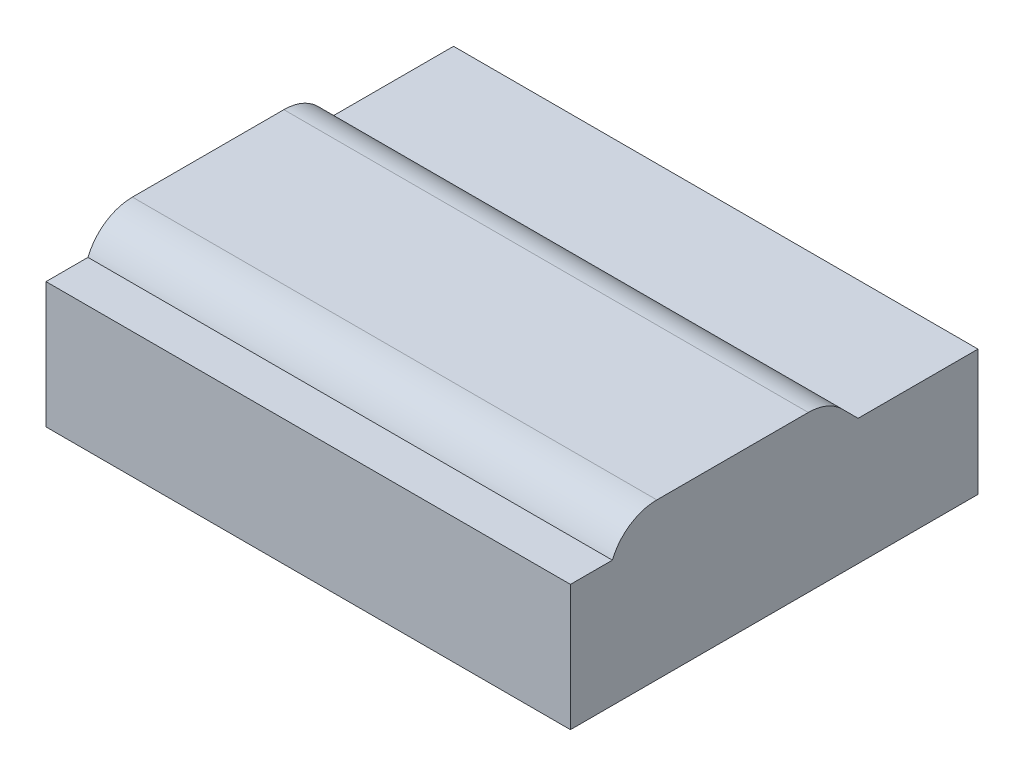
ISO-10303-21;
HEADER;
FILE_DESCRIPTION(('STEP AP214'),'2;1');
FILE_NAME('part.step','',(''),(''),'','','');
FILE_SCHEMA(('AUTOMOTIVE_DESIGN { 1 0 10303 214 1 1 1 1 }'));
ENDSEC;
DATA;
#1=APPLICATION_CONTEXT('core data for automotive mechanical design processes');
#2=APPLICATION_PROTOCOL_DEFINITION('international standard','automotive_design',2000,#1);
#3=PRODUCT_CONTEXT('',#1,'mechanical');
#4=PRODUCT('Part','Part','',(#3));
#5=PRODUCT_RELATED_PRODUCT_CATEGORY('part','',(#4));
#6=PRODUCT_DEFINITION_FORMATION('','',#4);
#7=PRODUCT_DEFINITION_CONTEXT('part definition',#1,'design');
#8=PRODUCT_DEFINITION('design','',#6,#7);
#9=PRODUCT_DEFINITION_SHAPE('','',#8);
#10=(LENGTH_UNIT() NAMED_UNIT(*) SI_UNIT(.MILLI.,.METRE.));
#11=(NAMED_UNIT(*) PLANE_ANGLE_UNIT() SI_UNIT($,.RADIAN.));
#12=(NAMED_UNIT(*) SI_UNIT($,.STERADIAN.) SOLID_ANGLE_UNIT());
#13=UNCERTAINTY_MEASURE_WITH_UNIT(LENGTH_MEASURE(1.E-05),#10,'distance_accuracy_value','');
#14=(GEOMETRIC_REPRESENTATION_CONTEXT(3) GLOBAL_UNCERTAINTY_ASSIGNED_CONTEXT((#13)) GLOBAL_UNIT_ASSIGNED_CONTEXT((#10,
#11,#12)) REPRESENTATION_CONTEXT('',''));
#15=CARTESIAN_POINT('',(0.,0.,0.));
#16=DIRECTION('',(0.,0.,1.));
#17=DIRECTION('',(1.,0.,0.));
#18=AXIS2_PLACEMENT_3D('',#15,#16,#17);
#19=CARTESIAN_POINT('',(0.,0.,0.));
#20=DIRECTION('',(0.,1.,0.));
#21=DIRECTION('',(0.,0.,1.));
#22=AXIS2_PLACEMENT_3D('',#19,#20,#21);
#23=PLANE('',#22);
#24=DIRECTION('',(0.,0.,-1.));
#25=VECTOR('',#24,1.);
#26=CARTESIAN_POINT('',(437.5,0.,-680.));
#27=LINE('',#26,#25);
#28=CARTESIAN_POINT('',(437.5,0.,0.));
#29=VERTEX_POINT('',#28);
#30=CARTESIAN_POINT('',(437.5,0.,-70.0000000000001));
#31=VERTEX_POINT('',#30);
#32=EDGE_CURVE('E176',#29,#31,#27,.T.);
#33=ORIENTED_EDGE('',*,*,#32,.T.);
#34=DIRECTION('',(-1.,0.,0.));
#35=VECTOR('',#34,1.);
#36=CARTESIAN_POINT('',(850.537528561268,0.,-70.));
#37=LINE('',#36,#35);
#38=CARTESIAN_POINT('',(-437.5,0.,-70.0000000000001));
#39=VERTEX_POINT('',#38);
#40=EDGE_CURVE('E130',#31,#39,#37,.T.);
#41=ORIENTED_EDGE('',*,*,#40,.T.);
#42=DIRECTION('',(0.,0.,1.));
#43=VECTOR('',#42,1.);
#44=CARTESIAN_POINT('',(-437.5,0.,-680.));
#45=LINE('',#44,#43);
#46=CARTESIAN_POINT('',(-437.5,0.,0.));
#47=VERTEX_POINT('',#46);
#48=EDGE_CURVE('E127',#39,#47,#45,.T.);
#49=ORIENTED_EDGE('',*,*,#48,.T.);
#50=DIRECTION('',(1.,0.,0.));
#51=VECTOR('',#50,1.);
#52=CARTESIAN_POINT('',(-437.5,0.,0.));
#53=LINE('',#52,#51);
#54=EDGE_CURVE('E126',#47,#29,#53,.T.);
#55=ORIENTED_EDGE('',*,*,#54,.T.);
#56=EDGE_LOOP('',(#33,#41,#49,#55));
#57=FACE_BOUND('',#56,.T.);
#58=ADVANCED_FACE('F37',(#57),#23,.T.);
#59=CARTESIAN_POINT('',(-437.5,-210.,-680.));
#60=DIRECTION('',(-1.,0.,0.));
#61=DIRECTION('',(0.,0.,1.));
#62=AXIS2_PLACEMENT_3D('',#59,#60,#61);
#63=PLANE('',#62);
#64=ORIENTED_EDGE('',*,*,#48,.F.);
#65=CARTESIAN_POINT('',(-437.5,-30.,-144.161984870957));
#66=DIRECTION('',(-1.,0.,0.));
#67=DIRECTION('',(0.,0.,1.));
#68=AXIS2_PLACEMENT_3D('',#65,#66,#67);
#69=CIRCLE('',#68,80.);
#70=CARTESIAN_POINT('',(-437.5,50.,-144.161984870957));
#71=VERTEX_POINT('',#70);
#72=EDGE_CURVE('E202',#39,#71,#69,.T.);
#73=ORIENTED_EDGE('',*,*,#72,.T.);
#74=DIRECTION('',(0.,0.,-1.));
#75=VECTOR('',#74,1.);
#76=CARTESIAN_POINT('',(-437.5,50.,0.));
#77=LINE('',#76,#75);
#78=CARTESIAN_POINT('',(-437.5,50.,-396.862915010153));
#79=VERTEX_POINT('',#78);
#80=EDGE_CURVE('E117',#71,#79,#77,.T.);
#81=ORIENTED_EDGE('',*,*,#80,.T.);
#82=CARTESIAN_POINT('',(-437.5,-30.,-396.862915010153));
#83=DIRECTION('',(-1.,0.,0.));
#84=DIRECTION('',(0.,0.,1.));
#85=AXIS2_PLACEMENT_3D('',#82,#83,#84);
#86=CIRCLE('',#85,80.);
#87=CARTESIAN_POINT('',(-437.5,26.5685424949238,-453.431457505076));
#88=VERTEX_POINT('',#87);
#89=EDGE_CURVE('E114',#79,#88,#86,.T.);
#90=ORIENTED_EDGE('',*,*,#89,.T.);
#91=DIRECTION('',(0.,-0.707106781186547,-0.707106781186548));
#92=VECTOR('',#91,1.);
#93=CARTESIAN_POINT('',(-437.5,240.,-240.));
#94=LINE('',#93,#92);
#95=CARTESIAN_POINT('',(-437.5,0.,-480.));
#96=VERTEX_POINT('',#95);
#97=EDGE_CURVE('E107',#88,#96,#94,.T.);
#98=ORIENTED_EDGE('',*,*,#97,.T.);
#99=CARTESIAN_POINT('',(-437.5,0.,-680.));
#100=VERTEX_POINT('',#99);
#101=EDGE_CURVE('E111',#100,#96,#45,.T.);
#102=ORIENTED_EDGE('',*,*,#101,.F.);
#103=DIRECTION('',(0.,1.,0.));
#104=VECTOR('',#103,1.);
#105=CARTESIAN_POINT('',(-437.5,-210.,-680.));
#106=LINE('',#105,#104);
#107=CARTESIAN_POINT('',(-437.5,-210.,-680.));
#108=VERTEX_POINT('',#107);
#109=EDGE_CURVE('E174',#108,#100,#106,.T.);
#110=ORIENTED_EDGE('',*,*,#109,.F.);
#111=DIRECTION('',(0.,0.,1.));
#112=VECTOR('',#111,1.);
#113=CARTESIAN_POINT('',(-437.5,-210.,-680.));
#114=LINE('',#113,#112);
#115=CARTESIAN_POINT('',(-437.5,-210.,0.));
#116=VERTEX_POINT('',#115);
#117=EDGE_CURVE('E149',#108,#116,#114,.T.);
#118=ORIENTED_EDGE('',*,*,#117,.T.);
#119=DIRECTION('',(0.,1.,0.));
#120=VECTOR('',#119,1.);
#121=CARTESIAN_POINT('',(-437.5,-210.,0.));
#122=LINE('',#121,#120);
#123=EDGE_CURVE('E161',#116,#47,#122,.T.);
#124=ORIENTED_EDGE('',*,*,#123,.T.);
#125=EDGE_LOOP('',(#64,#73,#81,#90,#98,#102,#110,#118,#124));
#126=FACE_BOUND('',#125,.T.);
#127=ADVANCED_FACE('F110',(#126),#63,.T.);
#128=CARTESIAN_POINT('',(-437.5,-210.,-680.));
#129=DIRECTION('',(0.,0.,-1.));
#130=DIRECTION('',(-1.,0.,0.));
#131=AXIS2_PLACEMENT_3D('',#128,#129,#130);
#132=PLANE('',#131);
#133=DIRECTION('',(-1.,0.,0.));
#134=VECTOR('',#133,1.);
#135=CARTESIAN_POINT('',(-437.5,0.,-680.));
#136=LINE('',#135,#134);
#137=CARTESIAN_POINT('',(437.5,0.,-680.));
#138=VERTEX_POINT('',#137);
#139=EDGE_CURVE('E125',#138,#100,#136,.T.);
#140=ORIENTED_EDGE('',*,*,#139,.F.);
#141=DIRECTION('',(0.,1.,0.));
#142=VECTOR('',#141,1.);
#143=CARTESIAN_POINT('',(437.5,-210.,-680.));
#144=LINE('',#143,#142);
#145=CARTESIAN_POINT('',(437.5,-210.,-680.));
#146=VERTEX_POINT('',#145);
#147=EDGE_CURVE('E171',#146,#138,#144,.T.);
#148=ORIENTED_EDGE('',*,*,#147,.F.);
#149=DIRECTION('',(-1.,0.,0.));
#150=VECTOR('',#149,1.);
#151=CARTESIAN_POINT('',(-437.5,-210.,-680.));
#152=LINE('',#151,#150);
#153=EDGE_CURVE('E158',#146,#108,#152,.T.);
#154=ORIENTED_EDGE('',*,*,#153,.T.);
#155=ORIENTED_EDGE('',*,*,#109,.T.);
#156=EDGE_LOOP('',(#140,#148,#154,#155));
#157=FACE_BOUND('',#156,.T.);
#158=ADVANCED_FACE('F218',(#157),#132,.T.);
#159=CARTESIAN_POINT('',(437.5,-210.,-680.));
#160=DIRECTION('',(1.,0.,0.));
#161=DIRECTION('',(0.,0.,-1.));
#162=AXIS2_PLACEMENT_3D('',#159,#160,#161);
#163=PLANE('',#162);
#164=DIRECTION('',(0.,0.,-1.));
#165=VECTOR('',#164,1.);
#166=CARTESIAN_POINT('',(437.5,50.,1.43096655774299E-13));
#167=LINE('',#166,#165);
#168=CARTESIAN_POINT('',(437.5,50.,-144.161984870957));
#169=VERTEX_POINT('',#168);
#170=CARTESIAN_POINT('',(437.5,50.,-396.862915010152));
#171=VERTEX_POINT('',#170);
#172=EDGE_CURVE('E133',#169,#171,#167,.T.);
#173=ORIENTED_EDGE('',*,*,#172,.F.);
#174=CARTESIAN_POINT('',(437.5,-30.,-144.161984870957));
#175=DIRECTION('',(1.,0.,0.));
#176=DIRECTION('',(0.,0.,-1.));
#177=AXIS2_PLACEMENT_3D('',#174,#175,#176);
#178=CIRCLE('',#177,80.);
#179=EDGE_CURVE('E45',#169,#31,#178,.T.);
#180=ORIENTED_EDGE('',*,*,#179,.T.);
#181=ORIENTED_EDGE('',*,*,#32,.F.);
#182=DIRECTION('',(0.,1.,0.));
#183=VECTOR('',#182,1.);
#184=CARTESIAN_POINT('',(437.5,-210.,0.));
#185=LINE('',#184,#183);
#186=CARTESIAN_POINT('',(437.5,-210.,0.));
#187=VERTEX_POINT('',#186);
#188=EDGE_CURVE('E169',#187,#29,#185,.T.);
#189=ORIENTED_EDGE('',*,*,#188,.F.);
#190=DIRECTION('',(0.,0.,-1.));
#191=VECTOR('',#190,1.);
#192=CARTESIAN_POINT('',(437.5,-210.,-680.));
#193=LINE('',#192,#191);
#194=EDGE_CURVE('E155',#187,#146,#193,.T.);
#195=ORIENTED_EDGE('',*,*,#194,.T.);
#196=ORIENTED_EDGE('',*,*,#147,.T.);
#197=CARTESIAN_POINT('',(437.5,0.,-480.));
#198=VERTEX_POINT('',#197);
#199=EDGE_CURVE('E139',#198,#138,#27,.T.);
#200=ORIENTED_EDGE('',*,*,#199,.F.);
#201=DIRECTION('',(0.,-0.707106781186547,-0.707106781186548));
#202=VECTOR('',#201,1.);
#203=CARTESIAN_POINT('',(437.5,240.,-240.));
#204=LINE('',#203,#202);
#205=CARTESIAN_POINT('',(437.5,26.5685424949238,-453.431457505076));
#206=VERTEX_POINT('',#205);
#207=EDGE_CURVE('E116',#206,#198,#204,.T.);
#208=ORIENTED_EDGE('',*,*,#207,.F.);
#209=CARTESIAN_POINT('',(437.5,-30.,-396.862915010153));
#210=DIRECTION('',(1.,0.,0.));
#211=DIRECTION('',(0.,0.,-1.));
#212=AXIS2_PLACEMENT_3D('',#209,#210,#211);
#213=CIRCLE('',#212,80.);
#214=EDGE_CURVE('E57',#206,#171,#213,.T.);
#215=ORIENTED_EDGE('',*,*,#214,.T.);
#216=EDGE_LOOP('',(#173,#180,#181,#189,#195,#196,#200,#208,#215));
#217=FACE_BOUND('',#216,.T.);
#218=ADVANCED_FACE('F189',(#217),#163,.T.);
#219=CARTESIAN_POINT('',(-437.5,-210.,0.));
#220=DIRECTION('',(0.,0.,1.));
#221=DIRECTION('',(1.,0.,0.));
#222=AXIS2_PLACEMENT_3D('',#219,#220,#221);
#223=PLANE('',#222);
#224=ORIENTED_EDGE('',*,*,#54,.F.);
#225=ORIENTED_EDGE('',*,*,#123,.F.);
#226=DIRECTION('',(1.,0.,0.));
#227=VECTOR('',#226,1.);
#228=CARTESIAN_POINT('',(-437.5,-210.,0.));
#229=LINE('',#228,#227);
#230=EDGE_CURVE('E152',#116,#187,#229,.T.);
#231=ORIENTED_EDGE('',*,*,#230,.T.);
#232=ORIENTED_EDGE('',*,*,#188,.T.);
#233=EDGE_LOOP('',(#224,#225,#231,#232));
#234=FACE_BOUND('',#233,.T.);
#235=ADVANCED_FACE('F186',(#234),#223,.T.);
#236=CARTESIAN_POINT('',(0.,-210.,0.));
#237=DIRECTION('',(0.,1.,0.));
#238=DIRECTION('',(0.,0.,1.));
#239=AXIS2_PLACEMENT_3D('',#236,#237,#238);
#240=PLANE('',#239);
#241=ORIENTED_EDGE('',*,*,#117,.F.);
#242=ORIENTED_EDGE('',*,*,#153,.F.);
#243=ORIENTED_EDGE('',*,*,#194,.F.);
#244=ORIENTED_EDGE('',*,*,#230,.F.);
#245=EDGE_LOOP('',(#241,#242,#243,#244));
#246=FACE_BOUND('',#245,.T.);
#247=ADVANCED_FACE('F216',(#246),#240,.F.);
#248=DIRECTION('',(-1.,0.,0.));
#249=VECTOR('',#248,1.);
#250=CARTESIAN_POINT('',(850.537528561268,0.,-480.));
#251=LINE('',#250,#249);
#252=EDGE_CURVE('E122',#198,#96,#251,.T.);
#253=ORIENTED_EDGE('',*,*,#252,.F.);
#254=ORIENTED_EDGE('',*,*,#199,.T.);
#255=ORIENTED_EDGE('',*,*,#139,.T.);
#256=ORIENTED_EDGE('',*,*,#101,.T.);
#257=EDGE_LOOP('',(#253,#254,#255,#256));
#258=FACE_BOUND('',#257,.T.);
#259=ADVANCED_FACE('F121',(#258),#23,.T.);
#260=CARTESIAN_POINT('',(850.537528561268,240.,-240.));
#261=DIRECTION('',(0.,0.707106781186548,-0.707106781186547));
#262=DIRECTION('',(0.,0.707106781186547,0.707106781186548));
#263=AXIS2_PLACEMENT_3D('',#260,#261,#262);
#264=PLANE('',#263);
#265=ORIENTED_EDGE('',*,*,#97,.F.);
#266=DIRECTION('',(-1.,0.,0.));
#267=VECTOR('',#266,1.);
#268=CARTESIAN_POINT('',(850.537528561268,26.5685424949238,-453.431457505076));
#269=LINE('',#268,#267);
#270=EDGE_CURVE('E11',#88,#206,#269,.F.);
#271=ORIENTED_EDGE('',*,*,#270,.T.);
#272=ORIENTED_EDGE('',*,*,#207,.T.);
#273=ORIENTED_EDGE('',*,*,#252,.T.);
#274=EDGE_LOOP('',(#265,#271,#272,#273));
#275=FACE_BOUND('',#274,.T.);
#276=ADVANCED_FACE('F129',(#275),#264,.T.);
#277=CARTESIAN_POINT('',(850.537528561268,50.,0.));
#278=DIRECTION('',(0.,1.,0.));
#279=DIRECTION('',(0.,0.,1.));
#280=AXIS2_PLACEMENT_3D('',#277,#278,#279);
#281=PLANE('',#280);
#282=ORIENTED_EDGE('',*,*,#80,.F.);
#283=DIRECTION('',(1.,0.,0.));
#284=VECTOR('',#283,1.);
#285=CARTESIAN_POINT('',(437.5,50.,-144.161984870957));
#286=LINE('',#285,#284);
#287=EDGE_CURVE('E194',#71,#169,#286,.T.);
#288=ORIENTED_EDGE('',*,*,#287,.T.);
#289=ORIENTED_EDGE('',*,*,#172,.T.);
#290=DIRECTION('',(-1.,0.,0.));
#291=VECTOR('',#290,1.);
#292=CARTESIAN_POINT('',(850.537528561268,50.,-396.862915010152));
#293=LINE('',#292,#291);
#294=EDGE_CURVE('E204',#171,#79,#293,.T.);
#295=ORIENTED_EDGE('',*,*,#294,.T.);
#296=EDGE_LOOP('',(#282,#288,#289,#295));
#297=FACE_BOUND('',#296,.T.);
#298=ADVANCED_FACE('F210',(#297),#281,.T.);
#299=CARTESIAN_POINT('',(850.537528561268,-30.,-144.161984870957));
#300=DIRECTION('',(-1.,0.,0.));
#301=DIRECTION('',(0.,0.,1.));
#302=AXIS2_PLACEMENT_3D('',#299,#300,#301);
#303=CYLINDRICAL_SURFACE('',#302,80.);
#304=ORIENTED_EDGE('',*,*,#179,.F.);
#305=ORIENTED_EDGE('',*,*,#287,.F.);
#306=ORIENTED_EDGE('',*,*,#72,.F.);
#307=ORIENTED_EDGE('',*,*,#40,.F.);
#308=EDGE_LOOP('',(#304,#305,#306,#307));
#309=FACE_BOUND('',#308,.T.);
#310=ADVANCED_FACE('F211',(#309),#303,.T.);
#311=CARTESIAN_POINT('',(850.537528561268,-30.,-396.862915010152));
#312=DIRECTION('',(-1.,0.,0.));
#313=DIRECTION('',(0.,0.,1.));
#314=AXIS2_PLACEMENT_3D('',#311,#312,#313);
#315=CYLINDRICAL_SURFACE('',#314,80.);
#316=ORIENTED_EDGE('',*,*,#214,.F.);
#317=ORIENTED_EDGE('',*,*,#270,.F.);
#318=ORIENTED_EDGE('',*,*,#89,.F.);
#319=ORIENTED_EDGE('',*,*,#294,.F.);
#320=EDGE_LOOP('',(#316,#317,#318,#319));
#321=FACE_BOUND('',#320,.T.);
#322=ADVANCED_FACE('F39',(#321),#315,.T.);
#323=CLOSED_SHELL('',(#58,#127,#158,#218,#235,#247,#259,#276,#298,#310,#322));
#324=MANIFOLD_SOLID_BREP('B2',#323);
#325=ADVANCED_BREP_SHAPE_REPRESENTATION('',(#18,#324),#14);
#326=SHAPE_DEFINITION_REPRESENTATION(#9,#325);
ENDSEC;
END-ISO-10303-21;
